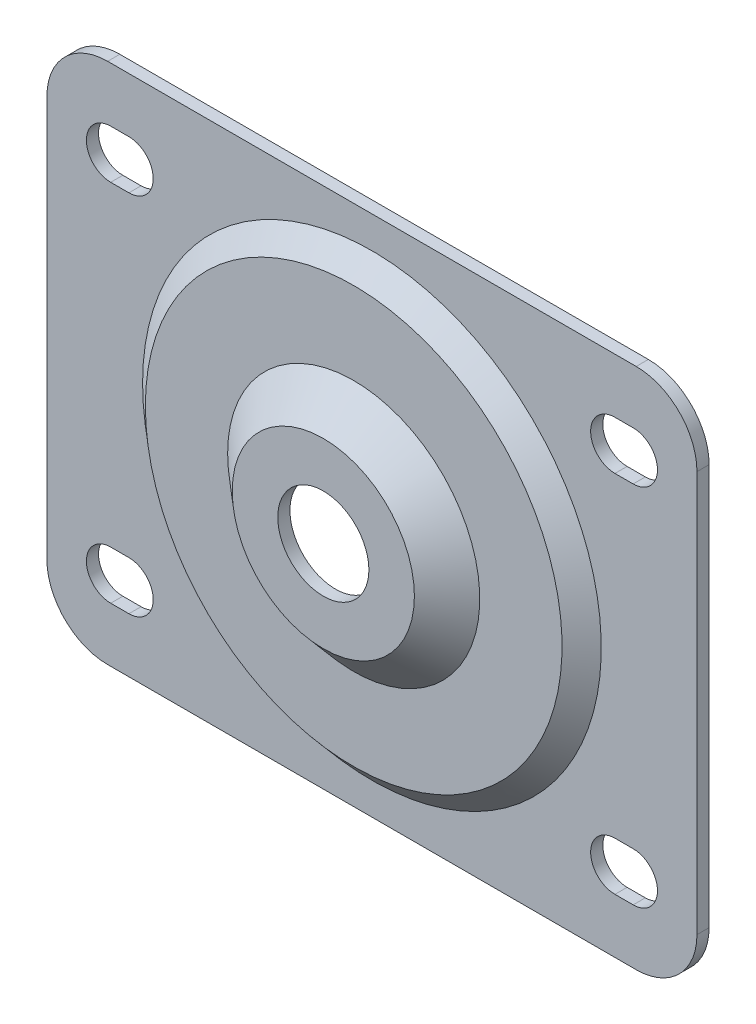
ISO-10303-21;
HEADER;
FILE_DESCRIPTION(('STEP AP214'),'2;1');
FILE_NAME('part.step','',(''),(''),'','','');
FILE_SCHEMA(('AUTOMOTIVE_DESIGN { 1 0 10303 214 1 1 1 1 }'));
ENDSEC;
DATA;
#1=APPLICATION_CONTEXT('core data for automotive mechanical design processes');
#2=APPLICATION_PROTOCOL_DEFINITION('international standard','automotive_design',2000,#1);
#3=PRODUCT_CONTEXT('',#1,'mechanical');
#4=PRODUCT('Part','Part','',(#3));
#5=PRODUCT_RELATED_PRODUCT_CATEGORY('part','',(#4));
#6=PRODUCT_DEFINITION_FORMATION('','',#4);
#7=PRODUCT_DEFINITION_CONTEXT('part definition',#1,'design');
#8=PRODUCT_DEFINITION('design','',#6,#7);
#9=PRODUCT_DEFINITION_SHAPE('','',#8);
#10=(LENGTH_UNIT() NAMED_UNIT(*) SI_UNIT(.MILLI.,.METRE.));
#11=(NAMED_UNIT(*) PLANE_ANGLE_UNIT() SI_UNIT($,.RADIAN.));
#12=(NAMED_UNIT(*) SI_UNIT($,.STERADIAN.) SOLID_ANGLE_UNIT());
#13=UNCERTAINTY_MEASURE_WITH_UNIT(LENGTH_MEASURE(1.E-05),#10,'distance_accuracy_value','');
#14=(GEOMETRIC_REPRESENTATION_CONTEXT(3) GLOBAL_UNCERTAINTY_ASSIGNED_CONTEXT((#13)) GLOBAL_UNIT_ASSIGNED_CONTEXT((#10,
#11,#12)) REPRESENTATION_CONTEXT('',''));
#15=CARTESIAN_POINT('',(0.,0.,0.));
#16=DIRECTION('',(0.,0.,1.));
#17=DIRECTION('',(1.,0.,0.));
#18=AXIS2_PLACEMENT_3D('',#15,#16,#17);
#19=CARTESIAN_POINT('',(0.,0.,0.));
#20=DIRECTION('',(0.,0.,-1.));
#21=DIRECTION('',(-1.,0.,0.));
#22=AXIS2_PLACEMENT_3D('',#19,#20,#21);
#23=PLANE('',#22);
#24=DIRECTION('',(-1.,0.,0.));
#25=VECTOR('',#24,1.);
#26=CARTESIAN_POINT('',(-43.,-26.,0.));
#27=LINE('',#26,#25);
#28=CARTESIAN_POINT('',(-40.,-26.,0.));
#29=VERTEX_POINT('',#28);
#30=CARTESIAN_POINT('',(-43.,-26.,0.));
#31=VERTEX_POINT('',#30);
#32=EDGE_CURVE('E211',#29,#31,#27,.T.);
#33=ORIENTED_EDGE('',*,*,#32,.T.);
#34=CARTESIAN_POINT('',(-43.,-30.,0.));
#35=DIRECTION('',(0.,0.,1.));
#36=DIRECTION('',(-1.,0.,0.));
#37=AXIS2_PLACEMENT_3D('',#34,#35,#36);
#38=CIRCLE('',#37,4.);
#39=CARTESIAN_POINT('',(-43.,-34.,0.));
#40=VERTEX_POINT('',#39);
#41=EDGE_CURVE('E231',#31,#40,#38,.T.);
#42=ORIENTED_EDGE('',*,*,#41,.T.);
#43=DIRECTION('',(1.,0.,0.));
#44=VECTOR('',#43,1.);
#45=CARTESIAN_POINT('',(-43.,-34.,0.));
#46=LINE('',#45,#44);
#47=CARTESIAN_POINT('',(-40.,-34.,0.));
#48=VERTEX_POINT('',#47);
#49=EDGE_CURVE('E217',#40,#48,#46,.T.);
#50=ORIENTED_EDGE('',*,*,#49,.T.);
#51=CARTESIAN_POINT('',(-40.,-30.,0.));
#52=DIRECTION('',(0.,0.,1.));
#53=DIRECTION('',(-1.,0.,0.));
#54=AXIS2_PLACEMENT_3D('',#51,#52,#53);
#55=CIRCLE('',#54,4.);
#56=EDGE_CURVE('E235',#48,#29,#55,.T.);
#57=ORIENTED_EDGE('',*,*,#56,.T.);
#58=EDGE_LOOP('',(#33,#42,#50,#57));
#59=FACE_BOUND('',#58,.T.);
#60=DIRECTION('',(1.,0.,0.));
#61=VECTOR('',#60,1.);
#62=CARTESIAN_POINT('',(43.,-34.,0.));
#63=LINE('',#62,#61);
#64=CARTESIAN_POINT('',(40.,-34.,0.));
#65=VERTEX_POINT('',#64);
#66=CARTESIAN_POINT('',(43.,-34.,0.));
#67=VERTEX_POINT('',#66);
#68=EDGE_CURVE('E247',#65,#67,#63,.T.);
#69=ORIENTED_EDGE('',*,*,#68,.T.);
#70=CARTESIAN_POINT('',(43.,-30.,0.));
#71=DIRECTION('',(0.,0.,1.));
#72=DIRECTION('',(1.,0.,0.));
#73=AXIS2_PLACEMENT_3D('',#70,#71,#72);
#74=CIRCLE('',#73,4.);
#75=CARTESIAN_POINT('',(43.,-26.,0.));
#76=VERTEX_POINT('',#75);
#77=EDGE_CURVE('E218',#67,#76,#74,.T.);
#78=ORIENTED_EDGE('',*,*,#77,.T.);
#79=DIRECTION('',(-1.,0.,0.));
#80=VECTOR('',#79,1.);
#81=CARTESIAN_POINT('',(43.,-26.,0.));
#82=LINE('',#81,#80);
#83=CARTESIAN_POINT('',(40.,-26.,0.));
#84=VERTEX_POINT('',#83);
#85=EDGE_CURVE('E257',#76,#84,#82,.T.);
#86=ORIENTED_EDGE('',*,*,#85,.T.);
#87=CARTESIAN_POINT('',(40.,-30.,0.));
#88=DIRECTION('',(0.,0.,1.));
#89=DIRECTION('',(1.,0.,0.));
#90=AXIS2_PLACEMENT_3D('',#87,#88,#89);
#91=CIRCLE('',#90,4.);
#92=EDGE_CURVE('E260',#84,#65,#91,.T.);
#93=ORIENTED_EDGE('',*,*,#92,.T.);
#94=EDGE_LOOP('',(#69,#78,#86,#93));
#95=FACE_BOUND('',#94,.T.);
#96=DIRECTION('',(1.,0.,0.));
#97=VECTOR('',#96,1.);
#98=CARTESIAN_POINT('',(43.,26.,0.));
#99=LINE('',#98,#97);
#100=CARTESIAN_POINT('',(40.,26.,0.));
#101=VERTEX_POINT('',#100);
#102=CARTESIAN_POINT('',(43.,26.,0.));
#103=VERTEX_POINT('',#102);
#104=EDGE_CURVE('E278',#101,#103,#99,.T.);
#105=ORIENTED_EDGE('',*,*,#104,.T.);
#106=CARTESIAN_POINT('',(43.,30.,0.));
#107=DIRECTION('',(0.,0.,1.));
#108=DIRECTION('',(-1.,0.,0.));
#109=AXIS2_PLACEMENT_3D('',#106,#107,#108);
#110=CIRCLE('',#109,4.);
#111=CARTESIAN_POINT('',(43.,34.,0.));
#112=VERTEX_POINT('',#111);
#113=EDGE_CURVE('E274',#103,#112,#110,.T.);
#114=ORIENTED_EDGE('',*,*,#113,.T.);
#115=DIRECTION('',(-1.,0.,0.));
#116=VECTOR('',#115,1.);
#117=CARTESIAN_POINT('',(43.,34.,0.));
#118=LINE('',#117,#116);
#119=CARTESIAN_POINT('',(40.,34.,0.));
#120=VERTEX_POINT('',#119);
#121=EDGE_CURVE('E288',#112,#120,#118,.T.);
#122=ORIENTED_EDGE('',*,*,#121,.T.);
#123=CARTESIAN_POINT('',(40.,30.,0.));
#124=DIRECTION('',(0.,0.,1.));
#125=DIRECTION('',(-1.,0.,0.));
#126=AXIS2_PLACEMENT_3D('',#123,#124,#125);
#127=CIRCLE('',#126,4.);
#128=EDGE_CURVE('E291',#120,#101,#127,.T.);
#129=ORIENTED_EDGE('',*,*,#128,.T.);
#130=EDGE_LOOP('',(#105,#114,#122,#129));
#131=FACE_BOUND('',#130,.T.);
#132=DIRECTION('',(-1.,0.,0.));
#133=VECTOR('',#132,1.);
#134=CARTESIAN_POINT('',(-43.,34.,0.));
#135=LINE('',#134,#133);
#136=CARTESIAN_POINT('',(-40.,34.,0.));
#137=VERTEX_POINT('',#136);
#138=CARTESIAN_POINT('',(-43.,34.,0.));
#139=VERTEX_POINT('',#138);
#140=EDGE_CURVE('E309',#137,#139,#135,.T.);
#141=ORIENTED_EDGE('',*,*,#140,.T.);
#142=CARTESIAN_POINT('',(-43.,30.,0.));
#143=DIRECTION('',(0.,0.,1.));
#144=DIRECTION('',(1.,0.,0.));
#145=AXIS2_PLACEMENT_3D('',#142,#143,#144);
#146=CIRCLE('',#145,4.);
#147=CARTESIAN_POINT('',(-43.,26.,0.));
#148=VERTEX_POINT('',#147);
#149=EDGE_CURVE('E305',#139,#148,#146,.T.);
#150=ORIENTED_EDGE('',*,*,#149,.T.);
#151=DIRECTION('',(1.,0.,0.));
#152=VECTOR('',#151,1.);
#153=CARTESIAN_POINT('',(-43.,26.,0.));
#154=LINE('',#153,#152);
#155=CARTESIAN_POINT('',(-40.,26.,0.));
#156=VERTEX_POINT('',#155);
#157=EDGE_CURVE('E319',#148,#156,#154,.T.);
#158=ORIENTED_EDGE('',*,*,#157,.T.);
#159=CARTESIAN_POINT('',(-40.,30.,0.));
#160=DIRECTION('',(0.,0.,1.));
#161=DIRECTION('',(1.,0.,0.));
#162=AXIS2_PLACEMENT_3D('',#159,#160,#161);
#163=CIRCLE('',#162,4.);
#164=EDGE_CURVE('E322',#156,#137,#163,.T.);
#165=ORIENTED_EDGE('',*,*,#164,.T.);
#166=EDGE_LOOP('',(#141,#150,#158,#165));
#167=FACE_BOUND('',#166,.T.);
#168=DIRECTION('',(0.,-1.,0.));
#169=VECTOR('',#168,1.);
#170=CARTESIAN_POINT('',(-53.5,43.,0.));
#171=LINE('',#170,#169);
#172=CARTESIAN_POINT('',(-53.5,33.,0.));
#173=VERTEX_POINT('',#172);
#174=CARTESIAN_POINT('',(-53.5,-33.,0.));
#175=VERTEX_POINT('',#174);
#176=EDGE_CURVE('E336',#173,#175,#171,.T.);
#177=ORIENTED_EDGE('',*,*,#176,.F.);
#178=CARTESIAN_POINT('',(-43.5,33.,0.));
#179=DIRECTION('',(0.,0.,-1.));
#180=DIRECTION('',(-1.,0.,0.));
#181=AXIS2_PLACEMENT_3D('',#178,#179,#180);
#182=CIRCLE('',#181,10.);
#183=CARTESIAN_POINT('',(-43.5,43.,0.));
#184=VERTEX_POINT('',#183);
#185=EDGE_CURVE('E368',#173,#184,#182,.T.);
#186=ORIENTED_EDGE('',*,*,#185,.T.);
#187=DIRECTION('',(-1.,0.,0.));
#188=VECTOR('',#187,1.);
#189=CARTESIAN_POINT('',(53.5,43.,0.));
#190=LINE('',#189,#188);
#191=CARTESIAN_POINT('',(43.5,43.,0.));
#192=VERTEX_POINT('',#191);
#193=EDGE_CURVE('E341',#192,#184,#190,.T.);
#194=ORIENTED_EDGE('',*,*,#193,.F.);
#195=CARTESIAN_POINT('',(43.5,33.,0.));
#196=DIRECTION('',(0.,0.,-1.));
#197=DIRECTION('',(-1.,0.,0.));
#198=AXIS2_PLACEMENT_3D('',#195,#196,#197);
#199=CIRCLE('',#198,10.);
#200=CARTESIAN_POINT('',(53.5,33.,0.));
#201=VERTEX_POINT('',#200);
#202=EDGE_CURVE('E362',#192,#201,#199,.T.);
#203=ORIENTED_EDGE('',*,*,#202,.T.);
#204=DIRECTION('',(0.,1.,0.));
#205=VECTOR('',#204,1.);
#206=CARTESIAN_POINT('',(53.5,43.,0.));
#207=LINE('',#206,#205);
#208=CARTESIAN_POINT('',(53.5,-33.,0.));
#209=VERTEX_POINT('',#208);
#210=EDGE_CURVE('E354',#209,#201,#207,.T.);
#211=ORIENTED_EDGE('',*,*,#210,.F.);
#212=CARTESIAN_POINT('',(43.5,-33.,0.));
#213=DIRECTION('',(0.,0.,-1.));
#214=DIRECTION('',(-1.,0.,0.));
#215=AXIS2_PLACEMENT_3D('',#212,#213,#214);
#216=CIRCLE('',#215,10.);
#217=CARTESIAN_POINT('',(43.5,-43.,0.));
#218=VERTEX_POINT('',#217);
#219=EDGE_CURVE('E364',#209,#218,#216,.T.);
#220=ORIENTED_EDGE('',*,*,#219,.T.);
#221=DIRECTION('',(1.,0.,0.));
#222=VECTOR('',#221,1.);
#223=CARTESIAN_POINT('',(53.5,-43.,0.));
#224=LINE('',#223,#222);
#225=CARTESIAN_POINT('',(-43.5,-43.,0.));
#226=VERTEX_POINT('',#225);
#227=EDGE_CURVE('E351',#226,#218,#224,.T.);
#228=ORIENTED_EDGE('',*,*,#227,.F.);
#229=CARTESIAN_POINT('',(-43.5,-33.,0.));
#230=DIRECTION('',(0.,0.,-1.));
#231=DIRECTION('',(-1.,0.,0.));
#232=AXIS2_PLACEMENT_3D('',#229,#230,#231);
#233=CIRCLE('',#232,10.);
#234=EDGE_CURVE('E366',#226,#175,#233,.T.);
#235=ORIENTED_EDGE('',*,*,#234,.T.);
#236=EDGE_LOOP('',(#177,#186,#194,#203,#211,#220,#228,#235));
#237=FACE_BOUND('',#236,.T.);
#238=CARTESIAN_POINT('',(0.,0.,0.));
#239=DIRECTION('',(0.,0.,-1.));
#240=DIRECTION('',(-1.,0.,0.));
#241=AXIS2_PLACEMENT_3D('',#238,#239,#240);
#242=CIRCLE('',#241,37.);
#243=CARTESIAN_POINT('',(-37.,0.,0.));
#244=VERTEX_POINT('',#243);
#245=EDGE_CURVE('E754',#244,#244,#242,.F.);
#246=ORIENTED_EDGE('',*,*,#245,.T.);
#247=EDGE_LOOP('',(#246));
#248=FACE_BOUND('',#247,.T.);
#249=ADVANCED_FACE('F36',(#59,#95,#131,#167,#237,#248),#23,.T.);
#250=CARTESIAN_POINT('',(0.,0.,2.));
#251=DIRECTION('',(0.,0.,-1.));
#252=DIRECTION('',(-1.,0.,0.));
#253=AXIS2_PLACEMENT_3D('',#250,#251,#252);
#254=PLANE('',#253);
#255=CARTESIAN_POINT('',(0.,0.,2.));
#256=DIRECTION('',(0.,0.,-1.));
#257=DIRECTION('',(-1.,0.,0.));
#258=AXIS2_PLACEMENT_3D('',#255,#256,#257);
#259=CIRCLE('',#258,37.75);
#260=CARTESIAN_POINT('',(-37.75,0.,2.));
#261=VERTEX_POINT('',#260);
#262=EDGE_CURVE('E11',#261,#261,#259,.F.);
#263=ORIENTED_EDGE('',*,*,#262,.F.);
#264=EDGE_LOOP('',(#263));
#265=FACE_BOUND('',#264,.T.);
#266=CARTESIAN_POINT('',(43.,-30.,2.));
#267=DIRECTION('',(0.,0.,1.));
#268=DIRECTION('',(1.,0.,0.));
#269=AXIS2_PLACEMENT_3D('',#266,#267,#268);
#270=CIRCLE('',#269,4.);
#271=CARTESIAN_POINT('',(43.,-34.,2.));
#272=VERTEX_POINT('',#271);
#273=CARTESIAN_POINT('',(43.,-26.,2.));
#274=VERTEX_POINT('',#273);
#275=EDGE_CURVE('E244',#272,#274,#270,.T.);
#276=ORIENTED_EDGE('',*,*,#275,.F.);
#277=DIRECTION('',(1.,0.,0.));
#278=VECTOR('',#277,1.);
#279=CARTESIAN_POINT('',(43.,-34.,2.));
#280=LINE('',#279,#278);
#281=CARTESIAN_POINT('',(40.,-34.,2.));
#282=VERTEX_POINT('',#281);
#283=EDGE_CURVE('E252',#282,#272,#280,.T.);
#284=ORIENTED_EDGE('',*,*,#283,.F.);
#285=CARTESIAN_POINT('',(40.,-30.,2.));
#286=DIRECTION('',(0.,0.,1.));
#287=DIRECTION('',(1.,0.,0.));
#288=AXIS2_PLACEMENT_3D('',#285,#286,#287);
#289=CIRCLE('',#288,4.);
#290=CARTESIAN_POINT('',(40.,-26.,2.));
#291=VERTEX_POINT('',#290);
#292=EDGE_CURVE('E249',#291,#282,#289,.T.);
#293=ORIENTED_EDGE('',*,*,#292,.F.);
#294=DIRECTION('',(-1.,0.,0.));
#295=VECTOR('',#294,1.);
#296=CARTESIAN_POINT('',(43.,-26.,2.));
#297=LINE('',#296,#295);
#298=EDGE_CURVE('E246',#274,#291,#297,.T.);
#299=ORIENTED_EDGE('',*,*,#298,.F.);
#300=EDGE_LOOP('',(#276,#284,#293,#299));
#301=FACE_BOUND('',#300,.T.);
#302=CARTESIAN_POINT('',(-43.,30.,2.));
#303=DIRECTION('',(0.,0.,1.));
#304=DIRECTION('',(1.,0.,0.));
#305=AXIS2_PLACEMENT_3D('',#302,#303,#304);
#306=CIRCLE('',#305,4.);
#307=CARTESIAN_POINT('',(-43.,34.,2.));
#308=VERTEX_POINT('',#307);
#309=CARTESIAN_POINT('',(-43.,26.,2.));
#310=VERTEX_POINT('',#309);
#311=EDGE_CURVE('E306',#308,#310,#306,.T.);
#312=ORIENTED_EDGE('',*,*,#311,.F.);
#313=DIRECTION('',(-1.,0.,0.));
#314=VECTOR('',#313,1.);
#315=CARTESIAN_POINT('',(-43.,34.,2.));
#316=LINE('',#315,#314);
#317=CARTESIAN_POINT('',(-40.,34.,2.));
#318=VERTEX_POINT('',#317);
#319=EDGE_CURVE('E314',#318,#308,#316,.T.);
#320=ORIENTED_EDGE('',*,*,#319,.F.);
#321=CARTESIAN_POINT('',(-40.,30.,2.));
#322=DIRECTION('',(0.,0.,1.));
#323=DIRECTION('',(1.,0.,0.));
#324=AXIS2_PLACEMENT_3D('',#321,#322,#323);
#325=CIRCLE('',#324,4.);
#326=CARTESIAN_POINT('',(-40.,26.,2.));
#327=VERTEX_POINT('',#326);
#328=EDGE_CURVE('E311',#327,#318,#325,.T.);
#329=ORIENTED_EDGE('',*,*,#328,.F.);
#330=DIRECTION('',(1.,0.,0.));
#331=VECTOR('',#330,1.);
#332=CARTESIAN_POINT('',(-43.,26.,2.));
#333=LINE('',#332,#331);
#334=EDGE_CURVE('E308',#310,#327,#333,.T.);
#335=ORIENTED_EDGE('',*,*,#334,.F.);
#336=EDGE_LOOP('',(#312,#320,#329,#335));
#337=FACE_BOUND('',#336,.T.);
#338=DIRECTION('',(-1.,0.,0.));
#339=VECTOR('',#338,1.);
#340=CARTESIAN_POINT('',(53.5,43.,2.));
#341=LINE('',#340,#339);
#342=CARTESIAN_POINT('',(43.5,43.,2.));
#343=VERTEX_POINT('',#342);
#344=CARTESIAN_POINT('',(-43.5,43.,2.));
#345=VERTEX_POINT('',#344);
#346=EDGE_CURVE('E345',#343,#345,#341,.T.);
#347=ORIENTED_EDGE('',*,*,#346,.T.);
#348=CARTESIAN_POINT('',(-43.5,33.,2.));
#349=DIRECTION('',(0.,0.,-1.));
#350=DIRECTION('',(-1.,0.,0.));
#351=AXIS2_PLACEMENT_3D('',#348,#349,#350);
#352=CIRCLE('',#351,10.);
#353=CARTESIAN_POINT('',(-53.5,33.,2.));
#354=VERTEX_POINT('',#353);
#355=EDGE_CURVE('E380',#345,#354,#352,.F.);
#356=ORIENTED_EDGE('',*,*,#355,.T.);
#357=DIRECTION('',(0.,-1.,0.));
#358=VECTOR('',#357,1.);
#359=CARTESIAN_POINT('',(-53.5,43.,2.));
#360=LINE('',#359,#358);
#361=CARTESIAN_POINT('',(-53.5,-33.,2.));
#362=VERTEX_POINT('',#361);
#363=EDGE_CURVE('E337',#354,#362,#360,.T.);
#364=ORIENTED_EDGE('',*,*,#363,.T.);
#365=CARTESIAN_POINT('',(-43.5,-33.,2.));
#366=DIRECTION('',(0.,0.,-1.));
#367=DIRECTION('',(-1.,0.,0.));
#368=AXIS2_PLACEMENT_3D('',#365,#366,#367);
#369=CIRCLE('',#368,10.);
#370=CARTESIAN_POINT('',(-43.5,-43.,2.));
#371=VERTEX_POINT('',#370);
#372=EDGE_CURVE('E378',#362,#371,#369,.F.);
#373=ORIENTED_EDGE('',*,*,#372,.T.);
#374=DIRECTION('',(1.,0.,0.));
#375=VECTOR('',#374,1.);
#376=CARTESIAN_POINT('',(53.5,-43.,2.));
#377=LINE('',#376,#375);
#378=CARTESIAN_POINT('',(43.5,-43.,2.));
#379=VERTEX_POINT('',#378);
#380=EDGE_CURVE('E340',#371,#379,#377,.T.);
#381=ORIENTED_EDGE('',*,*,#380,.T.);
#382=CARTESIAN_POINT('',(43.5,-33.,2.));
#383=DIRECTION('',(0.,0.,-1.));
#384=DIRECTION('',(-1.,0.,0.));
#385=AXIS2_PLACEMENT_3D('',#382,#383,#384);
#386=CIRCLE('',#385,10.);
#387=CARTESIAN_POINT('',(53.5,-33.,2.));
#388=VERTEX_POINT('',#387);
#389=EDGE_CURVE('E58',#379,#388,#386,.F.);
#390=ORIENTED_EDGE('',*,*,#389,.T.);
#391=DIRECTION('',(0.,1.,0.));
#392=VECTOR('',#391,1.);
#393=CARTESIAN_POINT('',(53.5,43.,2.));
#394=LINE('',#393,#392);
#395=CARTESIAN_POINT('',(53.5,33.,2.));
#396=VERTEX_POINT('',#395);
#397=EDGE_CURVE('E343',#388,#396,#394,.T.);
#398=ORIENTED_EDGE('',*,*,#397,.T.);
#399=CARTESIAN_POINT('',(43.5,33.,2.));
#400=DIRECTION('',(0.,0.,-1.));
#401=DIRECTION('',(-1.,0.,0.));
#402=AXIS2_PLACEMENT_3D('',#399,#400,#401);
#403=CIRCLE('',#402,10.);
#404=EDGE_CURVE('E375',#396,#343,#403,.F.);
#405=ORIENTED_EDGE('',*,*,#404,.T.);
#406=EDGE_LOOP('',(#347,#356,#364,#373,#381,#390,#398,#405));
#407=FACE_BOUND('',#406,.T.);
#408=CARTESIAN_POINT('',(43.,30.,2.));
#409=DIRECTION('',(0.,0.,1.));
#410=DIRECTION('',(-1.,0.,0.));
#411=AXIS2_PLACEMENT_3D('',#408,#409,#410);
#412=CIRCLE('',#411,4.);
#413=CARTESIAN_POINT('',(43.,26.,2.));
#414=VERTEX_POINT('',#413);
#415=CARTESIAN_POINT('',(43.,34.,2.));
#416=VERTEX_POINT('',#415);
#417=EDGE_CURVE('E275',#414,#416,#412,.T.);
#418=ORIENTED_EDGE('',*,*,#417,.F.);
#419=DIRECTION('',(1.,0.,0.));
#420=VECTOR('',#419,1.);
#421=CARTESIAN_POINT('',(43.,26.,2.));
#422=LINE('',#421,#420);
#423=CARTESIAN_POINT('',(40.,26.,2.));
#424=VERTEX_POINT('',#423);
#425=EDGE_CURVE('E283',#424,#414,#422,.T.);
#426=ORIENTED_EDGE('',*,*,#425,.F.);
#427=CARTESIAN_POINT('',(40.,30.,2.));
#428=DIRECTION('',(0.,0.,1.));
#429=DIRECTION('',(-1.,0.,0.));
#430=AXIS2_PLACEMENT_3D('',#427,#428,#429);
#431=CIRCLE('',#430,4.);
#432=CARTESIAN_POINT('',(40.,34.,2.));
#433=VERTEX_POINT('',#432);
#434=EDGE_CURVE('E280',#433,#424,#431,.T.);
#435=ORIENTED_EDGE('',*,*,#434,.F.);
#436=DIRECTION('',(-1.,0.,0.));
#437=VECTOR('',#436,1.);
#438=CARTESIAN_POINT('',(43.,34.,2.));
#439=LINE('',#438,#437);
#440=EDGE_CURVE('E277',#416,#433,#439,.T.);
#441=ORIENTED_EDGE('',*,*,#440,.F.);
#442=EDGE_LOOP('',(#418,#426,#435,#441));
#443=FACE_BOUND('',#442,.T.);
#444=CARTESIAN_POINT('',(-43.,-30.,2.));
#445=DIRECTION('',(0.,0.,1.));
#446=DIRECTION('',(-1.,0.,0.));
#447=AXIS2_PLACEMENT_3D('',#444,#445,#446);
#448=CIRCLE('',#447,4.);
#449=CARTESIAN_POINT('',(-43.,-26.,2.));
#450=VERTEX_POINT('',#449);
#451=CARTESIAN_POINT('',(-43.,-34.,2.));
#452=VERTEX_POINT('',#451);
#453=EDGE_CURVE('E200',#450,#452,#448,.T.);
#454=ORIENTED_EDGE('',*,*,#453,.F.);
#455=DIRECTION('',(-1.,0.,0.));
#456=VECTOR('',#455,1.);
#457=CARTESIAN_POINT('',(-43.,-26.,2.));
#458=LINE('',#457,#456);
#459=CARTESIAN_POINT('',(-40.,-26.,2.));
#460=VERTEX_POINT('',#459);
#461=EDGE_CURVE('E226',#460,#450,#458,.T.);
#462=ORIENTED_EDGE('',*,*,#461,.F.);
#463=CARTESIAN_POINT('',(-40.,-30.,2.));
#464=DIRECTION('',(0.,0.,1.));
#465=DIRECTION('',(-1.,0.,0.));
#466=AXIS2_PLACEMENT_3D('',#463,#464,#465);
#467=CIRCLE('',#466,4.);
#468=CARTESIAN_POINT('',(-40.,-34.,2.));
#469=VERTEX_POINT('',#468);
#470=EDGE_CURVE('E224',#469,#460,#467,.T.);
#471=ORIENTED_EDGE('',*,*,#470,.F.);
#472=DIRECTION('',(1.,0.,0.));
#473=VECTOR('',#472,1.);
#474=CARTESIAN_POINT('',(-43.,-34.,2.));
#475=LINE('',#474,#473);
#476=EDGE_CURVE('E210',#452,#469,#475,.T.);
#477=ORIENTED_EDGE('',*,*,#476,.F.);
#478=EDGE_LOOP('',(#454,#462,#471,#477));
#479=FACE_BOUND('',#478,.T.);
#480=ADVANCED_FACE('F222',(#265,#301,#337,#407,#443,#479),#254,.F.);
#481=CARTESIAN_POINT('',(-53.5,43.,2.));
#482=DIRECTION('',(1.,0.,0.));
#483=DIRECTION('',(0.,1.,0.));
#484=AXIS2_PLACEMENT_3D('',#481,#482,#483);
#485=PLANE('',#484);
#486=ORIENTED_EDGE('',*,*,#363,.F.);
#487=DIRECTION('',(0.,0.,-1.));
#488=VECTOR('',#487,1.);
#489=CARTESIAN_POINT('',(-53.5,33.,2.));
#490=LINE('',#489,#488);
#491=EDGE_CURVE('E359',#354,#173,#490,.T.);
#492=ORIENTED_EDGE('',*,*,#491,.T.);
#493=ORIENTED_EDGE('',*,*,#176,.T.);
#494=DIRECTION('',(0.,0.,-1.));
#495=VECTOR('',#494,1.);
#496=CARTESIAN_POINT('',(-53.5,-33.,2.));
#497=LINE('',#496,#495);
#498=EDGE_CURVE('E348',#175,#362,#497,.F.);
#499=ORIENTED_EDGE('',*,*,#498,.T.);
#500=EDGE_LOOP('',(#486,#492,#493,#499));
#501=FACE_BOUND('',#500,.T.);
#502=ADVANCED_FACE('F411',(#501),#485,.F.);
#503=CARTESIAN_POINT('',(53.5,-43.,2.));
#504=DIRECTION('',(0.,1.,0.));
#505=DIRECTION('',(-1.,0.,0.));
#506=AXIS2_PLACEMENT_3D('',#503,#504,#505);
#507=PLANE('',#506);
#508=ORIENTED_EDGE('',*,*,#380,.F.);
#509=DIRECTION('',(0.,0.,-1.));
#510=VECTOR('',#509,1.);
#511=CARTESIAN_POINT('',(-43.5,-43.,2.));
#512=LINE('',#511,#510);
#513=EDGE_CURVE('E384',#371,#226,#512,.T.);
#514=ORIENTED_EDGE('',*,*,#513,.T.);
#515=ORIENTED_EDGE('',*,*,#227,.T.);
#516=DIRECTION('',(0.,0.,-1.));
#517=VECTOR('',#516,1.);
#518=CARTESIAN_POINT('',(43.5,-43.,2.));
#519=LINE('',#518,#517);
#520=EDGE_CURVE('E382',#218,#379,#519,.F.);
#521=ORIENTED_EDGE('',*,*,#520,.T.);
#522=EDGE_LOOP('',(#508,#514,#515,#521));
#523=FACE_BOUND('',#522,.T.);
#524=ADVANCED_FACE('F419',(#523),#507,.F.);
#525=CARTESIAN_POINT('',(53.5,43.,2.));
#526=DIRECTION('',(-1.,0.,0.));
#527=DIRECTION('',(0.,-1.,0.));
#528=AXIS2_PLACEMENT_3D('',#525,#526,#527);
#529=PLANE('',#528);
#530=ORIENTED_EDGE('',*,*,#397,.F.);
#531=DIRECTION('',(0.,0.,-1.));
#532=VECTOR('',#531,1.);
#533=CARTESIAN_POINT('',(53.5,-33.,2.));
#534=LINE('',#533,#532);
#535=EDGE_CURVE('E44',#388,#209,#534,.T.);
#536=ORIENTED_EDGE('',*,*,#535,.T.);
#537=ORIENTED_EDGE('',*,*,#210,.T.);
#538=DIRECTION('',(0.,0.,-1.));
#539=VECTOR('',#538,1.);
#540=CARTESIAN_POINT('',(53.5,33.,2.));
#541=LINE('',#540,#539);
#542=EDGE_CURVE('E51',#201,#396,#541,.F.);
#543=ORIENTED_EDGE('',*,*,#542,.T.);
#544=EDGE_LOOP('',(#530,#536,#537,#543));
#545=FACE_BOUND('',#544,.T.);
#546=ADVANCED_FACE('F390',(#545),#529,.F.);
#547=CARTESIAN_POINT('',(53.5,43.,2.));
#548=DIRECTION('',(0.,-1.,0.));
#549=DIRECTION('',(1.,0.,0.));
#550=AXIS2_PLACEMENT_3D('',#547,#548,#549);
#551=PLANE('',#550);
#552=ORIENTED_EDGE('',*,*,#193,.T.);
#553=DIRECTION('',(0.,0.,-1.));
#554=VECTOR('',#553,1.);
#555=CARTESIAN_POINT('',(-43.5,43.,2.));
#556=LINE('',#555,#554);
#557=EDGE_CURVE('E373',#184,#345,#556,.F.);
#558=ORIENTED_EDGE('',*,*,#557,.T.);
#559=ORIENTED_EDGE('',*,*,#346,.F.);
#560=DIRECTION('',(0.,0.,-1.));
#561=VECTOR('',#560,1.);
#562=CARTESIAN_POINT('',(43.5,43.,2.));
#563=LINE('',#562,#561);
#564=EDGE_CURVE('E370',#343,#192,#563,.T.);
#565=ORIENTED_EDGE('',*,*,#564,.T.);
#566=EDGE_LOOP('',(#552,#558,#559,#565));
#567=FACE_BOUND('',#566,.T.);
#568=ADVANCED_FACE('F402',(#567),#551,.F.);
#569=CARTESIAN_POINT('',(-43.,30.,2.));
#570=DIRECTION('',(0.,0.,-1.));
#571=DIRECTION('',(-1.,0.,0.));
#572=AXIS2_PLACEMENT_3D('',#569,#570,#571);
#573=CYLINDRICAL_SURFACE('',#572,4.);
#574=ORIENTED_EDGE('',*,*,#149,.F.);
#575=DIRECTION('',(0.,0.,-1.));
#576=VECTOR('',#575,1.);
#577=CARTESIAN_POINT('',(-43.,34.,2.));
#578=LINE('',#577,#576);
#579=EDGE_CURVE('E316',#308,#139,#578,.T.);
#580=ORIENTED_EDGE('',*,*,#579,.F.);
#581=ORIENTED_EDGE('',*,*,#311,.T.);
#582=DIRECTION('',(0.,0.,-1.));
#583=VECTOR('',#582,1.);
#584=CARTESIAN_POINT('',(-43.,26.,2.));
#585=LINE('',#584,#583);
#586=EDGE_CURVE('E333',#310,#148,#585,.T.);
#587=ORIENTED_EDGE('',*,*,#586,.T.);
#588=EDGE_LOOP('',(#574,#580,#581,#587));
#589=FACE_BOUND('',#588,.T.);
#590=ADVANCED_FACE('F442',(#589),#573,.F.);
#591=CARTESIAN_POINT('',(-43.,26.,2.));
#592=DIRECTION('',(0.,1.,0.));
#593=DIRECTION('',(0.,0.,1.));
#594=AXIS2_PLACEMENT_3D('',#591,#592,#593);
#595=PLANE('',#594);
#596=ORIENTED_EDGE('',*,*,#157,.F.);
#597=ORIENTED_EDGE('',*,*,#586,.F.);
#598=ORIENTED_EDGE('',*,*,#334,.T.);
#599=DIRECTION('',(0.,0.,-1.));
#600=VECTOR('',#599,1.);
#601=CARTESIAN_POINT('',(-40.,26.,2.));
#602=LINE('',#601,#600);
#603=EDGE_CURVE('E331',#327,#156,#602,.T.);
#604=ORIENTED_EDGE('',*,*,#603,.T.);
#605=EDGE_LOOP('',(#596,#597,#598,#604));
#606=FACE_BOUND('',#605,.T.);
#607=ADVANCED_FACE('F509',(#606),#595,.T.);
#608=CARTESIAN_POINT('',(-40.,30.,2.));
#609=DIRECTION('',(0.,0.,-1.));
#610=DIRECTION('',(-1.,0.,0.));
#611=AXIS2_PLACEMENT_3D('',#608,#609,#610);
#612=CYLINDRICAL_SURFACE('',#611,4.);
#613=ORIENTED_EDGE('',*,*,#164,.F.);
#614=ORIENTED_EDGE('',*,*,#603,.F.);
#615=ORIENTED_EDGE('',*,*,#328,.T.);
#616=DIRECTION('',(0.,0.,-1.));
#617=VECTOR('',#616,1.);
#618=CARTESIAN_POINT('',(-40.,34.,2.));
#619=LINE('',#618,#617);
#620=EDGE_CURVE('E329',#318,#137,#619,.T.);
#621=ORIENTED_EDGE('',*,*,#620,.T.);
#622=EDGE_LOOP('',(#613,#614,#615,#621));
#623=FACE_BOUND('',#622,.T.);
#624=ADVANCED_FACE('F505',(#623),#612,.F.);
#625=CARTESIAN_POINT('',(-43.,34.,2.));
#626=DIRECTION('',(0.,-1.,0.));
#627=DIRECTION('',(0.,0.,-1.));
#628=AXIS2_PLACEMENT_3D('',#625,#626,#627);
#629=PLANE('',#628);
#630=ORIENTED_EDGE('',*,*,#140,.F.);
#631=ORIENTED_EDGE('',*,*,#620,.F.);
#632=ORIENTED_EDGE('',*,*,#319,.T.);
#633=ORIENTED_EDGE('',*,*,#579,.T.);
#634=EDGE_LOOP('',(#630,#631,#632,#633));
#635=FACE_BOUND('',#634,.T.);
#636=ADVANCED_FACE('F501',(#635),#629,.T.);
#637=CARTESIAN_POINT('',(43.,30.,2.));
#638=DIRECTION('',(0.,0.,-1.));
#639=DIRECTION('',(-1.,0.,0.));
#640=AXIS2_PLACEMENT_3D('',#637,#638,#639);
#641=CYLINDRICAL_SURFACE('',#640,4.);
#642=ORIENTED_EDGE('',*,*,#113,.F.);
#643=DIRECTION('',(0.,0.,-1.));
#644=VECTOR('',#643,1.);
#645=CARTESIAN_POINT('',(43.,26.,2.));
#646=LINE('',#645,#644);
#647=EDGE_CURVE('E285',#414,#103,#646,.T.);
#648=ORIENTED_EDGE('',*,*,#647,.F.);
#649=ORIENTED_EDGE('',*,*,#417,.T.);
#650=DIRECTION('',(0.,0.,-1.));
#651=VECTOR('',#650,1.);
#652=CARTESIAN_POINT('',(43.,34.,2.));
#653=LINE('',#652,#651);
#654=EDGE_CURVE('E302',#416,#112,#653,.T.);
#655=ORIENTED_EDGE('',*,*,#654,.T.);
#656=EDGE_LOOP('',(#642,#648,#649,#655));
#657=FACE_BOUND('',#656,.T.);
#658=ADVANCED_FACE('F497',(#657),#641,.F.);
#659=CARTESIAN_POINT('',(43.,34.,2.));
#660=DIRECTION('',(0.,-1.,0.));
#661=DIRECTION('',(0.,0.,-1.));
#662=AXIS2_PLACEMENT_3D('',#659,#660,#661);
#663=PLANE('',#662);
#664=ORIENTED_EDGE('',*,*,#121,.F.);
#665=ORIENTED_EDGE('',*,*,#654,.F.);
#666=ORIENTED_EDGE('',*,*,#440,.T.);
#667=DIRECTION('',(0.,0.,-1.));
#668=VECTOR('',#667,1.);
#669=CARTESIAN_POINT('',(40.,34.,2.));
#670=LINE('',#669,#668);
#671=EDGE_CURVE('E300',#433,#120,#670,.T.);
#672=ORIENTED_EDGE('',*,*,#671,.T.);
#673=EDGE_LOOP('',(#664,#665,#666,#672));
#674=FACE_BOUND('',#673,.T.);
#675=ADVANCED_FACE('F493',(#674),#663,.T.);
#676=CARTESIAN_POINT('',(40.,30.,2.));
#677=DIRECTION('',(0.,0.,-1.));
#678=DIRECTION('',(-1.,0.,0.));
#679=AXIS2_PLACEMENT_3D('',#676,#677,#678);
#680=CYLINDRICAL_SURFACE('',#679,4.);
#681=ORIENTED_EDGE('',*,*,#128,.F.);
#682=ORIENTED_EDGE('',*,*,#671,.F.);
#683=ORIENTED_EDGE('',*,*,#434,.T.);
#684=DIRECTION('',(0.,0.,-1.));
#685=VECTOR('',#684,1.);
#686=CARTESIAN_POINT('',(40.,26.,2.));
#687=LINE('',#686,#685);
#688=EDGE_CURVE('E298',#424,#101,#687,.T.);
#689=ORIENTED_EDGE('',*,*,#688,.T.);
#690=EDGE_LOOP('',(#681,#682,#683,#689));
#691=FACE_BOUND('',#690,.T.);
#692=ADVANCED_FACE('F489',(#691),#680,.F.);
#693=CARTESIAN_POINT('',(43.,26.,2.));
#694=DIRECTION('',(0.,1.,0.));
#695=DIRECTION('',(0.,0.,1.));
#696=AXIS2_PLACEMENT_3D('',#693,#694,#695);
#697=PLANE('',#696);
#698=ORIENTED_EDGE('',*,*,#104,.F.);
#699=ORIENTED_EDGE('',*,*,#688,.F.);
#700=ORIENTED_EDGE('',*,*,#425,.T.);
#701=ORIENTED_EDGE('',*,*,#647,.T.);
#702=EDGE_LOOP('',(#698,#699,#700,#701));
#703=FACE_BOUND('',#702,.T.);
#704=ADVANCED_FACE('F485',(#703),#697,.T.);
#705=CARTESIAN_POINT('',(43.,-30.,2.));
#706=DIRECTION('',(0.,0.,-1.));
#707=DIRECTION('',(-1.,0.,0.));
#708=AXIS2_PLACEMENT_3D('',#705,#706,#707);
#709=CYLINDRICAL_SURFACE('',#708,4.);
#710=ORIENTED_EDGE('',*,*,#77,.F.);
#711=DIRECTION('',(0.,0.,-1.));
#712=VECTOR('',#711,1.);
#713=CARTESIAN_POINT('',(43.,-34.,2.));
#714=LINE('',#713,#712);
#715=EDGE_CURVE('E254',#272,#67,#714,.T.);
#716=ORIENTED_EDGE('',*,*,#715,.F.);
#717=ORIENTED_EDGE('',*,*,#275,.T.);
#718=DIRECTION('',(0.,0.,-1.));
#719=VECTOR('',#718,1.);
#720=CARTESIAN_POINT('',(43.,-26.,2.));
#721=LINE('',#720,#719);
#722=EDGE_CURVE('E271',#274,#76,#721,.T.);
#723=ORIENTED_EDGE('',*,*,#722,.T.);
#724=EDGE_LOOP('',(#710,#716,#717,#723));
#725=FACE_BOUND('',#724,.T.);
#726=ADVANCED_FACE('F481',(#725),#709,.F.);
#727=CARTESIAN_POINT('',(43.,-26.,2.));
#728=DIRECTION('',(0.,-1.,0.));
#729=DIRECTION('',(0.,0.,-1.));
#730=AXIS2_PLACEMENT_3D('',#727,#728,#729);
#731=PLANE('',#730);
#732=ORIENTED_EDGE('',*,*,#85,.F.);
#733=ORIENTED_EDGE('',*,*,#722,.F.);
#734=ORIENTED_EDGE('',*,*,#298,.T.);
#735=DIRECTION('',(0.,0.,-1.));
#736=VECTOR('',#735,1.);
#737=CARTESIAN_POINT('',(40.,-26.,2.));
#738=LINE('',#737,#736);
#739=EDGE_CURVE('E269',#291,#84,#738,.T.);
#740=ORIENTED_EDGE('',*,*,#739,.T.);
#741=EDGE_LOOP('',(#732,#733,#734,#740));
#742=FACE_BOUND('',#741,.T.);
#743=ADVANCED_FACE('F477',(#742),#731,.T.);
#744=CARTESIAN_POINT('',(40.,-30.,2.));
#745=DIRECTION('',(0.,0.,-1.));
#746=DIRECTION('',(-1.,0.,0.));
#747=AXIS2_PLACEMENT_3D('',#744,#745,#746);
#748=CYLINDRICAL_SURFACE('',#747,4.);
#749=ORIENTED_EDGE('',*,*,#92,.F.);
#750=ORIENTED_EDGE('',*,*,#739,.F.);
#751=ORIENTED_EDGE('',*,*,#292,.T.);
#752=DIRECTION('',(0.,0.,-1.));
#753=VECTOR('',#752,1.);
#754=CARTESIAN_POINT('',(40.,-34.,2.));
#755=LINE('',#754,#753);
#756=EDGE_CURVE('E267',#282,#65,#755,.T.);
#757=ORIENTED_EDGE('',*,*,#756,.T.);
#758=EDGE_LOOP('',(#749,#750,#751,#757));
#759=FACE_BOUND('',#758,.T.);
#760=ADVANCED_FACE('F473',(#759),#748,.F.);
#761=CARTESIAN_POINT('',(43.,-34.,2.));
#762=DIRECTION('',(0.,1.,0.));
#763=DIRECTION('',(0.,0.,1.));
#764=AXIS2_PLACEMENT_3D('',#761,#762,#763);
#765=PLANE('',#764);
#766=ORIENTED_EDGE('',*,*,#68,.F.);
#767=ORIENTED_EDGE('',*,*,#756,.F.);
#768=ORIENTED_EDGE('',*,*,#283,.T.);
#769=ORIENTED_EDGE('',*,*,#715,.T.);
#770=EDGE_LOOP('',(#766,#767,#768,#769));
#771=FACE_BOUND('',#770,.T.);
#772=ADVANCED_FACE('F470',(#771),#765,.T.);
#773=CARTESIAN_POINT('',(-43.,-30.,2.));
#774=DIRECTION('',(0.,0.,-1.));
#775=DIRECTION('',(-1.,0.,0.));
#776=AXIS2_PLACEMENT_3D('',#773,#774,#775);
#777=CYLINDRICAL_SURFACE('',#776,4.);
#778=ORIENTED_EDGE('',*,*,#41,.F.);
#779=DIRECTION('',(0.,0.,-1.));
#780=VECTOR('',#779,1.);
#781=CARTESIAN_POINT('',(-43.,-26.,2.));
#782=LINE('',#781,#780);
#783=EDGE_CURVE('E206',#450,#31,#782,.T.);
#784=ORIENTED_EDGE('',*,*,#783,.F.);
#785=ORIENTED_EDGE('',*,*,#453,.T.);
#786=DIRECTION('',(0.,0.,-1.));
#787=VECTOR('',#786,1.);
#788=CARTESIAN_POINT('',(-43.,-34.,2.));
#789=LINE('',#788,#787);
#790=EDGE_CURVE('E203',#452,#40,#789,.T.);
#791=ORIENTED_EDGE('',*,*,#790,.T.);
#792=EDGE_LOOP('',(#778,#784,#785,#791));
#793=FACE_BOUND('',#792,.T.);
#794=ADVANCED_FACE('F202',(#793),#777,.F.);
#795=CARTESIAN_POINT('',(-43.,-34.,2.));
#796=DIRECTION('',(0.,1.,0.));
#797=DIRECTION('',(0.,0.,1.));
#798=AXIS2_PLACEMENT_3D('',#795,#796,#797);
#799=PLANE('',#798);
#800=ORIENTED_EDGE('',*,*,#49,.F.);
#801=ORIENTED_EDGE('',*,*,#790,.F.);
#802=ORIENTED_EDGE('',*,*,#476,.T.);
#803=DIRECTION('',(0.,0.,-1.));
#804=VECTOR('',#803,1.);
#805=CARTESIAN_POINT('',(-40.,-34.,2.));
#806=LINE('',#805,#804);
#807=EDGE_CURVE('E219',#469,#48,#806,.T.);
#808=ORIENTED_EDGE('',*,*,#807,.T.);
#809=EDGE_LOOP('',(#800,#801,#802,#808));
#810=FACE_BOUND('',#809,.T.);
#811=ADVANCED_FACE('F214',(#810),#799,.T.);
#812=CARTESIAN_POINT('',(-40.,-30.,2.));
#813=DIRECTION('',(0.,0.,-1.));
#814=DIRECTION('',(-1.,0.,0.));
#815=AXIS2_PLACEMENT_3D('',#812,#813,#814);
#816=CYLINDRICAL_SURFACE('',#815,4.);
#817=ORIENTED_EDGE('',*,*,#56,.F.);
#818=ORIENTED_EDGE('',*,*,#807,.F.);
#819=ORIENTED_EDGE('',*,*,#470,.T.);
#820=DIRECTION('',(0.,0.,-1.));
#821=VECTOR('',#820,1.);
#822=CARTESIAN_POINT('',(-40.,-26.,2.));
#823=LINE('',#822,#821);
#824=EDGE_CURVE('E241',#460,#29,#823,.T.);
#825=ORIENTED_EDGE('',*,*,#824,.T.);
#826=EDGE_LOOP('',(#817,#818,#819,#825));
#827=FACE_BOUND('',#826,.T.);
#828=ADVANCED_FACE('F454',(#827),#816,.F.);
#829=CARTESIAN_POINT('',(-43.,-26.,2.));
#830=DIRECTION('',(0.,-1.,0.));
#831=DIRECTION('',(0.,0.,-1.));
#832=AXIS2_PLACEMENT_3D('',#829,#830,#831);
#833=PLANE('',#832);
#834=ORIENTED_EDGE('',*,*,#32,.F.);
#835=ORIENTED_EDGE('',*,*,#824,.F.);
#836=ORIENTED_EDGE('',*,*,#461,.T.);
#837=ORIENTED_EDGE('',*,*,#783,.T.);
#838=EDGE_LOOP('',(#834,#835,#836,#837));
#839=FACE_BOUND('',#838,.T.);
#840=ADVANCED_FACE('F450',(#839),#833,.T.);
#841=CARTESIAN_POINT('',(-43.5,33.,2.));
#842=DIRECTION('',(0.,0.,-1.));
#843=DIRECTION('',(-1.,0.,0.));
#844=AXIS2_PLACEMENT_3D('',#841,#842,#843);
#845=CYLINDRICAL_SURFACE('',#844,10.);
#846=ORIENTED_EDGE('',*,*,#355,.F.);
#847=ORIENTED_EDGE('',*,*,#557,.F.);
#848=ORIENTED_EDGE('',*,*,#185,.F.);
#849=ORIENTED_EDGE('',*,*,#491,.F.);
#850=EDGE_LOOP('',(#846,#847,#848,#849));
#851=FACE_BOUND('',#850,.T.);
#852=ADVANCED_FACE('F409',(#851),#845,.T.);
#853=CARTESIAN_POINT('',(-43.5,-33.,2.));
#854=DIRECTION('',(0.,0.,-1.));
#855=DIRECTION('',(-1.,0.,0.));
#856=AXIS2_PLACEMENT_3D('',#853,#854,#855);
#857=CYLINDRICAL_SURFACE('',#856,10.);
#858=ORIENTED_EDGE('',*,*,#372,.F.);
#859=ORIENTED_EDGE('',*,*,#498,.F.);
#860=ORIENTED_EDGE('',*,*,#234,.F.);
#861=ORIENTED_EDGE('',*,*,#513,.F.);
#862=EDGE_LOOP('',(#858,#859,#860,#861));
#863=FACE_BOUND('',#862,.T.);
#864=ADVANCED_FACE('F416',(#863),#857,.T.);
#865=CARTESIAN_POINT('',(43.5,-33.,2.));
#866=DIRECTION('',(0.,0.,-1.));
#867=DIRECTION('',(-1.,0.,0.));
#868=AXIS2_PLACEMENT_3D('',#865,#866,#867);
#869=CYLINDRICAL_SURFACE('',#868,10.);
#870=ORIENTED_EDGE('',*,*,#389,.F.);
#871=ORIENTED_EDGE('',*,*,#520,.F.);
#872=ORIENTED_EDGE('',*,*,#219,.F.);
#873=ORIENTED_EDGE('',*,*,#535,.F.);
#874=EDGE_LOOP('',(#870,#871,#872,#873));
#875=FACE_BOUND('',#874,.T.);
#876=ADVANCED_FACE('F421',(#875),#869,.T.);
#877=CARTESIAN_POINT('',(43.5,33.,2.));
#878=DIRECTION('',(0.,0.,-1.));
#879=DIRECTION('',(-1.,0.,0.));
#880=AXIS2_PLACEMENT_3D('',#877,#878,#879);
#881=CYLINDRICAL_SURFACE('',#880,10.);
#882=ORIENTED_EDGE('',*,*,#404,.F.);
#883=ORIENTED_EDGE('',*,*,#542,.F.);
#884=ORIENTED_EDGE('',*,*,#202,.F.);
#885=ORIENTED_EDGE('',*,*,#564,.F.);
#886=EDGE_LOOP('',(#882,#883,#884,#885));
#887=FACE_BOUND('',#886,.T.);
#888=ADVANCED_FACE('F38',(#887),#881,.T.);
#889=CARTESIAN_POINT('',(14.9912952382604,0.,10.));
#890=DIRECTION('',(0.,0.,-1.));
#891=DIRECTION('',(-1.,0.,0.));
#892=AXIS2_PLACEMENT_3D('',#889,#890,#891);
#893=PLANE('',#892);
#894=CARTESIAN_POINT('',(0.,0.,10.));
#895=DIRECTION('',(0.,0.,1.));
#896=DIRECTION('',(1.,0.,0.));
#897=AXIS2_PLACEMENT_3D('',#894,#895,#896);
#898=CIRCLE('',#897,7.5);
#899=CARTESIAN_POINT('',(7.5,0.,10.));
#900=VERTEX_POINT('',#899);
#901=EDGE_CURVE('E749',#900,#900,#898,.T.);
#902=ORIENTED_EDGE('',*,*,#901,.F.);
#903=EDGE_LOOP('',(#902));
#904=FACE_BOUND('',#903,.T.);
#905=CARTESIAN_POINT('',(0.,0.,10.));
#906=DIRECTION('',(0.,0.,-1.));
#907=DIRECTION('',(-1.,0.,0.));
#908=AXIS2_PLACEMENT_3D('',#905,#906,#907);
#909=CIRCLE('',#908,14.9912952382604);
#910=CARTESIAN_POINT('',(-14.9912952382604,0.,10.));
#911=VERTEX_POINT('',#910);
#912=EDGE_CURVE('E233',#911,#911,#909,.T.);
#913=ORIENTED_EDGE('',*,*,#912,.F.);
#914=EDGE_LOOP('',(#913));
#915=FACE_BOUND('',#914,.T.);
#916=ADVANCED_FACE('F427',(#904,#915),#893,.F.);
#917=CARTESIAN_POINT('',(0.,0.,10.));
#918=DIRECTION('',(0.,0.,-1.));
#919=DIRECTION('',(-1.,0.,0.));
#920=AXIS2_PLACEMENT_3D('',#917,#918,#919);
#921=CONICAL_SURFACE('',#920,14.9912952382604,0.855801694085874);
#922=CARTESIAN_POINT('',(0.,0.,5.));
#923=DIRECTION('',(0.,0.,-1.));
#924=DIRECTION('',(-1.,0.,0.));
#925=AXIS2_PLACEMENT_3D('',#922,#923,#924);
#926=CIRCLE('',#925,20.75);
#927=CARTESIAN_POINT('',(-20.75,0.,5.));
#928=VERTEX_POINT('',#927);
#929=EDGE_CURVE('E772',#928,#928,#926,.T.);
#930=ORIENTED_EDGE('',*,*,#929,.F.);
#931=EDGE_LOOP('',(#930));
#932=FACE_BOUND('',#931,.T.);
#933=ORIENTED_EDGE('',*,*,#912,.T.);
#934=EDGE_LOOP('',(#933));
#935=FACE_BOUND('',#934,.T.);
#936=ADVANCED_FACE('F645',(#932,#935),#921,.T.);
#937=CARTESIAN_POINT('',(34.2947771429562,0.,5.));
#938=DIRECTION('',(0.,0.,-1.));
#939=DIRECTION('',(-1.,0.,0.));
#940=AXIS2_PLACEMENT_3D('',#937,#938,#939);
#941=PLANE('',#940);
#942=CARTESIAN_POINT('',(0.,0.,5.));
#943=DIRECTION('',(0.,0.,-1.));
#944=DIRECTION('',(-1.,0.,0.));
#945=AXIS2_PLACEMENT_3D('',#942,#943,#944);
#946=CIRCLE('',#945,34.2947771429562);
#947=CARTESIAN_POINT('',(-34.2947771429562,0.,5.));
#948=VERTEX_POINT('',#947);
#949=EDGE_CURVE('E769',#948,#948,#946,.T.);
#950=ORIENTED_EDGE('',*,*,#949,.F.);
#951=EDGE_LOOP('',(#950));
#952=FACE_BOUND('',#951,.T.);
#953=ORIENTED_EDGE('',*,*,#929,.T.);
#954=EDGE_LOOP('',(#953));
#955=FACE_BOUND('',#954,.T.);
#956=ADVANCED_FACE('F650',(#952,#955),#941,.F.);
#957=CARTESIAN_POINT('',(0.,0.,5.));
#958=DIRECTION('',(0.,0.,-1.));
#959=DIRECTION('',(-1.,0.,0.));
#960=AXIS2_PLACEMENT_3D('',#957,#958,#959);
#961=CONICAL_SURFACE('',#960,34.2947771429562,0.855801694085873);
#962=ORIENTED_EDGE('',*,*,#262,.T.);
#963=EDGE_LOOP('',(#962));
#964=FACE_BOUND('',#963,.T.);
#965=ORIENTED_EDGE('',*,*,#949,.T.);
#966=EDGE_LOOP('',(#965));
#967=FACE_BOUND('',#966,.T.);
#968=ADVANCED_FACE('F659',(#964,#967),#961,.T.);
#969=CARTESIAN_POINT('',(0.,0.,0.));
#970=DIRECTION('',(0.,0.,-1.));
#971=DIRECTION('',(-1.,0.,0.));
#972=AXIS2_PLACEMENT_3D('',#969,#970,#971);
#973=CYLINDRICAL_SURFACE('',#972,37.);
#974=ORIENTED_EDGE('',*,*,#245,.F.);
#975=EDGE_LOOP('',(#974));
#976=FACE_BOUND('',#975,.T.);
#977=CARTESIAN_POINT('',(0.,0.,0.00252092604917983));
#978=DIRECTION('',(0.,0.,-1.));
#979=DIRECTION('',(-1.,0.,0.));
#980=AXIS2_PLACEMENT_3D('',#977,#978,#979);
#981=CIRCLE('',#980,37.);
#982=CARTESIAN_POINT('',(-37.,0.,0.00252092604917983));
#983=VERTEX_POINT('',#982);
#984=EDGE_CURVE('E758',#983,#983,#981,.T.);
#985=ORIENTED_EDGE('',*,*,#984,.F.);
#986=EDGE_LOOP('',(#985));
#987=FACE_BOUND('',#986,.T.);
#988=ADVANCED_FACE('F668',(#976,#987),#973,.F.);
#989=CARTESIAN_POINT('',(14.9912952382604,0.,8.));
#990=DIRECTION('',(0.,0.,-1.));
#991=DIRECTION('',(-1.,0.,0.));
#992=AXIS2_PLACEMENT_3D('',#989,#990,#991);
#993=PLANE('',#992);
#994=CARTESIAN_POINT('',(0.,0.,8.));
#995=DIRECTION('',(0.,0.,1.));
#996=DIRECTION('',(1.,0.,0.));
#997=AXIS2_PLACEMENT_3D('',#994,#995,#996);
#998=CIRCLE('',#997,7.5);
#999=CARTESIAN_POINT('',(7.5,0.,8.));
#1000=VERTEX_POINT('',#999);
#1001=EDGE_CURVE('E746',#1000,#1000,#998,.T.);
#1002=ORIENTED_EDGE('',*,*,#1001,.T.);
#1003=EDGE_LOOP('',(#1002));
#1004=FACE_BOUND('',#1003,.T.);
#1005=CARTESIAN_POINT('',(0.,0.,8.));
#1006=DIRECTION('',(0.,0.,-1.));
#1007=DIRECTION('',(-1.,0.,0.));
#1008=AXIS2_PLACEMENT_3D('',#1005,#1006,#1007);
#1009=CIRCLE('',#1008,14.2441986920291);
#1010=CARTESIAN_POINT('',(-14.2441986920291,0.,8.));
#1011=VERTEX_POINT('',#1010);
#1012=EDGE_CURVE('E759',#1011,#1011,#1009,.T.);
#1013=ORIENTED_EDGE('',*,*,#1012,.T.);
#1014=EDGE_LOOP('',(#1013));
#1015=FACE_BOUND('',#1014,.T.);
#1016=ADVANCED_FACE('F684',(#1004,#1015),#993,.T.);
#1017=CARTESIAN_POINT('',(0.,0.,8.48980647981976));
#1018=DIRECTION('',(0.,0.,-1.));
#1019=DIRECTION('',(-1.,0.,0.));
#1020=AXIS2_PLACEMENT_3D('',#1017,#1018,#1019);
#1021=CONICAL_SURFACE('',#1020,13.6800685104953,0.855801694085874);
#1022=CARTESIAN_POINT('',(0.,0.,3.));
#1023=DIRECTION('',(0.,0.,-1.));
#1024=DIRECTION('',(-1.,0.,0.));
#1025=AXIS2_PLACEMENT_3D('',#1022,#1023,#1024);
#1026=CIRCLE('',#1025,20.0029034537687);
#1027=CARTESIAN_POINT('',(-20.0029034537687,0.,3.));
#1028=VERTEX_POINT('',#1027);
#1029=EDGE_CURVE('E762',#1028,#1028,#1026,.T.);
#1030=ORIENTED_EDGE('',*,*,#1029,.T.);
#1031=EDGE_LOOP('',(#1030));
#1032=FACE_BOUND('',#1031,.T.);
#1033=ORIENTED_EDGE('',*,*,#1012,.F.);
#1034=EDGE_LOOP('',(#1033));
#1035=FACE_BOUND('',#1034,.T.);
#1036=ADVANCED_FACE('F693',(#1032,#1035),#1021,.F.);
#1037=CARTESIAN_POINT('',(34.2947771429562,0.,3.));
#1038=DIRECTION('',(0.,0.,-1.));
#1039=DIRECTION('',(-1.,0.,0.));
#1040=AXIS2_PLACEMENT_3D('',#1037,#1038,#1039);
#1041=PLANE('',#1040);
#1042=CARTESIAN_POINT('',(0.,0.,3.));
#1043=DIRECTION('',(0.,0.,-1.));
#1044=DIRECTION('',(-1.,0.,0.));
#1045=AXIS2_PLACEMENT_3D('',#1042,#1043,#1044);
#1046=CIRCLE('',#1045,33.5476805967249);
#1047=CARTESIAN_POINT('',(-33.5476805967249,0.,3.));
#1048=VERTEX_POINT('',#1047);
#1049=EDGE_CURVE('E751',#1048,#1048,#1046,.T.);
#1050=ORIENTED_EDGE('',*,*,#1049,.T.);
#1051=EDGE_LOOP('',(#1050));
#1052=FACE_BOUND('',#1051,.T.);
#1053=ORIENTED_EDGE('',*,*,#1029,.F.);
#1054=EDGE_LOOP('',(#1053));
#1055=FACE_BOUND('',#1054,.T.);
#1056=ADVANCED_FACE('F698',(#1052,#1055),#1041,.T.);
#1057=CARTESIAN_POINT('',(0.,0.,3.48980647981976));
#1058=DIRECTION('',(0.,0.,-1.));
#1059=DIRECTION('',(-1.,0.,0.));
#1060=AXIS2_PLACEMENT_3D('',#1057,#1058,#1059);
#1061=CONICAL_SURFACE('',#1060,32.9835504151911,0.855801694085873);
#1062=ORIENTED_EDGE('',*,*,#984,.T.);
#1063=EDGE_LOOP('',(#1062));
#1064=FACE_BOUND('',#1063,.T.);
#1065=ORIENTED_EDGE('',*,*,#1049,.F.);
#1066=EDGE_LOOP('',(#1065));
#1067=FACE_BOUND('',#1066,.T.);
#1068=ADVANCED_FACE('F708',(#1064,#1067),#1061,.F.);
#1069=CARTESIAN_POINT('',(0.,0.,8.));
#1070=DIRECTION('',(0.,0.,1.));
#1071=DIRECTION('',(1.,0.,0.));
#1072=AXIS2_PLACEMENT_3D('',#1069,#1070,#1071);
#1073=CYLINDRICAL_SURFACE('',#1072,7.5);
#1074=ORIENTED_EDGE('',*,*,#1001,.F.);
#1075=EDGE_LOOP('',(#1074));
#1076=FACE_BOUND('',#1075,.T.);
#1077=ORIENTED_EDGE('',*,*,#901,.T.);
#1078=EDGE_LOOP('',(#1077));
#1079=FACE_BOUND('',#1078,.T.);
#1080=ADVANCED_FACE('F717',(#1076,#1079),#1073,.F.);
#1081=CLOSED_SHELL('',(#249,#480,#502,#524,#546,#568,#590,#607,#624,#636,#658,#675,#692,#704,
#726,#743,#760,#772,#794,#811,#828,#840,#852,#864,#876,#888,#916,#936,#956,#968,#988,#1016,
#1036,#1056,#1068,#1080));
#1082=MANIFOLD_SOLID_BREP('B2',#1081);
#1083=ADVANCED_BREP_SHAPE_REPRESENTATION('',(#18,#1082),#14);
#1084=SHAPE_DEFINITION_REPRESENTATION(#9,#1083);
ENDSEC;
END-ISO-10303-21;
